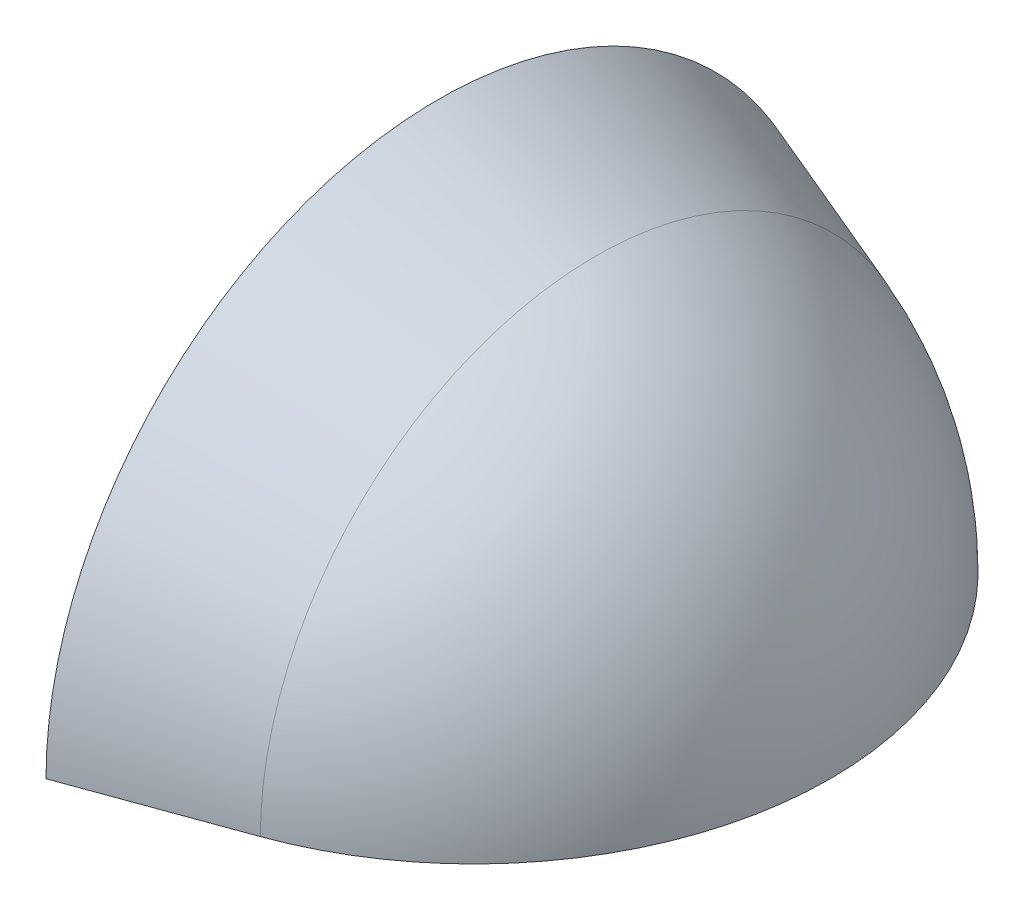
ISO-10303-21;
HEADER;
FILE_DESCRIPTION(('STEP AP214'),'2;1');
FILE_NAME('part.step','',(''),(''),'','','');
FILE_SCHEMA(('AUTOMOTIVE_DESIGN { 1 0 10303 214 1 1 1 1 }'));
ENDSEC;
DATA;
#1=APPLICATION_CONTEXT('core data for automotive mechanical design processes');
#2=APPLICATION_PROTOCOL_DEFINITION('international standard','automotive_design',2000,#1);
#3=PRODUCT_CONTEXT('',#1,'mechanical');
#4=PRODUCT('Part','Part','',(#3));
#5=PRODUCT_RELATED_PRODUCT_CATEGORY('part','',(#4));
#6=PRODUCT_DEFINITION_FORMATION('','',#4);
#7=PRODUCT_DEFINITION_CONTEXT('part definition',#1,'design');
#8=PRODUCT_DEFINITION('design','',#6,#7);
#9=PRODUCT_DEFINITION_SHAPE('','',#8);
#10=(LENGTH_UNIT() NAMED_UNIT(*) SI_UNIT(.MILLI.,.METRE.));
#11=(NAMED_UNIT(*) PLANE_ANGLE_UNIT() SI_UNIT($,.RADIAN.));
#12=(NAMED_UNIT(*) SI_UNIT($,.STERADIAN.) SOLID_ANGLE_UNIT());
#13=UNCERTAINTY_MEASURE_WITH_UNIT(LENGTH_MEASURE(1.E-05),#10,'distance_accuracy_value','');
#14=(GEOMETRIC_REPRESENTATION_CONTEXT(3) GLOBAL_UNCERTAINTY_ASSIGNED_CONTEXT((#13)) GLOBAL_UNIT_ASSIGNED_CONTEXT((#10,
#11,#12)) REPRESENTATION_CONTEXT('',''));
#15=CARTESIAN_POINT('',(0.,0.,0.));
#16=DIRECTION('',(0.,0.,1.));
#17=DIRECTION('',(1.,0.,0.));
#18=AXIS2_PLACEMENT_3D('',#15,#16,#17);
#19=CARTESIAN_POINT('',(-23.0885869016983,0.,0.));
#20=DIRECTION('',(1.,0.,0.));
#21=DIRECTION('',(0.,-1.,0.));
#22=AXIS2_PLACEMENT_3D('',#19,#20,#21);
#23=SPHERICAL_SURFACE('',#22,23.0885869016983);
#24=CARTESIAN_POINT('',(-23.0885869016983,0.,0.));
#25=DIRECTION('',(0.,1.,0.));
#26=DIRECTION('',(0.,0.,1.));
#27=AXIS2_PLACEMENT_3D('',#24,#25,#26);
#28=CIRCLE('',#27,23.0885869016983);
#29=CARTESIAN_POINT('',(-15.2137182709368,0.,-21.704130693615));
#30=VERTEX_POINT('',#29);
#31=CARTESIAN_POINT('',(-15.2137182709368,0.,21.704130693615));
#32=VERTEX_POINT('',#31);
#33=EDGE_CURVE('E73',#30,#32,#28,.F.);
#34=ORIENTED_EDGE('',*,*,#33,.F.);
#35=CARTESIAN_POINT('',(-15.2137182709368,0.,0.));
#36=DIRECTION('',(1.,0.,0.));
#37=DIRECTION('',(0.,1.,0.));
#38=AXIS2_PLACEMENT_3D('',#35,#36,#37);
#39=CIRCLE('',#38,21.704130693615);
#40=EDGE_CURVE('E47',#30,#32,#39,.T.);
#41=ORIENTED_EDGE('',*,*,#40,.T.);
#42=EDGE_LOOP('',(#34,#41));
#43=FACE_BOUND('',#42,.T.);
#44=ADVANCED_FACE('F39',(#43),#23,.T.);
#45=CARTESIAN_POINT('',(-15.2137182709368,0.,0.));
#46=DIRECTION('',(-1.,0.,0.));
#47=DIRECTION('',(0.,-1.,0.));
#48=AXIS2_PLACEMENT_3D('',#45,#46,#47);
#49=CONICAL_SURFACE('',#48,21.704130693615,0.348056955716178);
#50=DIRECTION('',(-0.940037204789634,0.,-0.341071918532282));
#51=VECTOR('',#50,1.);
#52=CARTESIAN_POINT('',(44.6056020572002,0.,0.));
#53=LINE('',#52,#51);
#54=CARTESIAN_POINT('',(-25.4,0.,-25.4));
#55=VERTEX_POINT('',#54);
#56=EDGE_CURVE('E58',#55,#30,#53,.F.);
#57=ORIENTED_EDGE('',*,*,#56,.F.);
#58=CARTESIAN_POINT('',(-25.4,0.,0.));
#59=DIRECTION('',(1.,0.,0.));
#60=DIRECTION('',(0.,1.,0.));
#61=AXIS2_PLACEMENT_3D('',#58,#59,#60);
#62=CIRCLE('',#61,25.4);
#63=CARTESIAN_POINT('',(-25.4,0.,25.4));
#64=VERTEX_POINT('',#63);
#65=EDGE_CURVE('E70',#55,#64,#62,.T.);
#66=ORIENTED_EDGE('',*,*,#65,.T.);
#67=DIRECTION('',(0.940037204789634,0.,-0.341071918532282));
#68=VECTOR('',#67,1.);
#69=CARTESIAN_POINT('',(44.6056020572002,0.,0.));
#70=LINE('',#69,#68);
#71=EDGE_CURVE('E53',#32,#64,#70,.F.);
#72=ORIENTED_EDGE('',*,*,#71,.F.);
#73=ORIENTED_EDGE('',*,*,#40,.F.);
#74=EDGE_LOOP('',(#57,#66,#72,#73));
#75=FACE_BOUND('',#74,.T.);
#76=ADVANCED_FACE('F69',(#75),#49,.T.);
#77=CARTESIAN_POINT('',(-25.4,0.,0.));
#78=DIRECTION('',(-1.,0.,0.));
#79=DIRECTION('',(0.,-1.,0.));
#80=AXIS2_PLACEMENT_3D('',#77,#78,#79);
#81=PLANE('',#80);
#82=DIRECTION('',(0.,0.,-1.));
#83=VECTOR('',#82,1.);
#84=CARTESIAN_POINT('',(-25.4,0.,0.));
#85=LINE('',#84,#83);
#86=EDGE_CURVE('E11',#64,#55,#85,.T.);
#87=ORIENTED_EDGE('',*,*,#86,.F.);
#88=ORIENTED_EDGE('',*,*,#65,.F.);
#89=EDGE_LOOP('',(#87,#88));
#90=FACE_BOUND('',#89,.T.);
#91=ADVANCED_FACE('F75',(#90),#81,.T.);
#92=CARTESIAN_POINT('',(7.83725951517691,0.,-25.4));
#93=DIRECTION('',(0.,1.,0.));
#94=DIRECTION('',(0.,0.,1.));
#95=AXIS2_PLACEMENT_3D('',#92,#93,#94);
#96=PLANE('',#95);
#97=ORIENTED_EDGE('',*,*,#33,.T.);
#98=ORIENTED_EDGE('',*,*,#71,.T.);
#99=ORIENTED_EDGE('',*,*,#86,.T.);
#100=ORIENTED_EDGE('',*,*,#56,.T.);
#101=EDGE_LOOP('',(#97,#98,#99,#100));
#102=FACE_BOUND('',#101,.T.);
#103=ADVANCED_FACE('F63',(#102),#96,.F.);
#104=CLOSED_SHELL('',(#44,#76,#91,#103));
#105=MANIFOLD_SOLID_BREP('B2',#104);
#106=ADVANCED_BREP_SHAPE_REPRESENTATION('',(#18,#105),#14);
#107=SHAPE_DEFINITION_REPRESENTATION(#9,#106);
ENDSEC;
END-ISO-10303-21;
